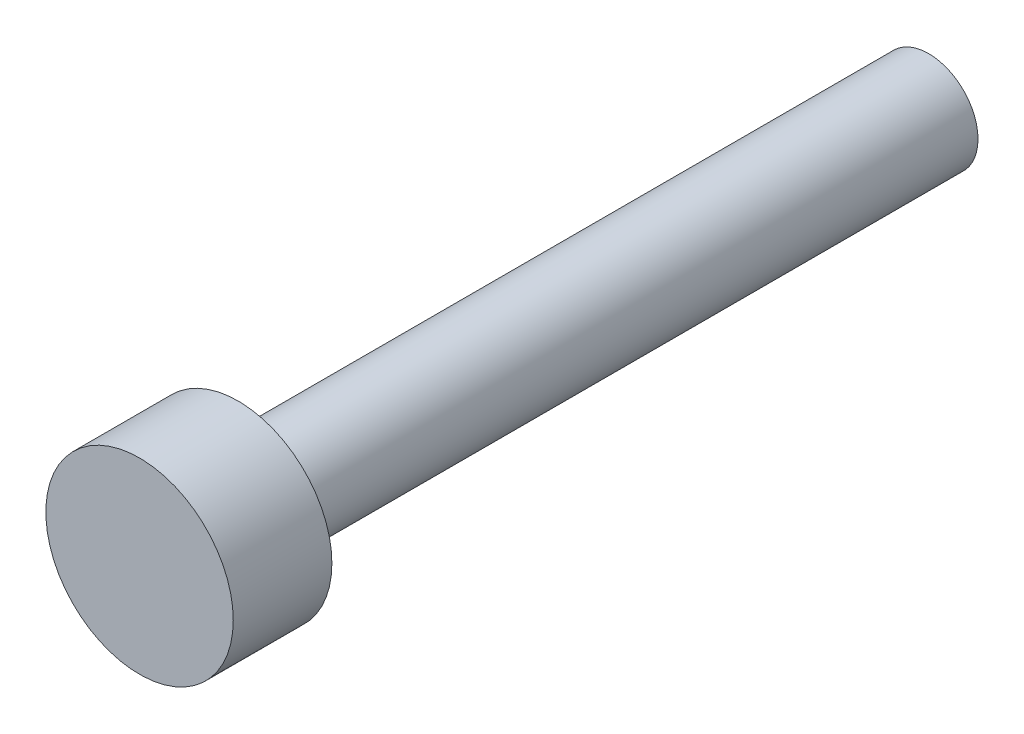
ISO-10303-21;
HEADER;
FILE_DESCRIPTION(('STEP AP214'),'2;1');
FILE_NAME('part.step','',(''),(''),'','','');
FILE_SCHEMA(('AUTOMOTIVE_DESIGN { 1 0 10303 214 1 1 1 1 }'));
ENDSEC;
DATA;
#1=APPLICATION_CONTEXT('core data for automotive mechanical design processes');
#2=APPLICATION_PROTOCOL_DEFINITION('international standard','automotive_design',2000,#1);
#3=PRODUCT_CONTEXT('',#1,'mechanical');
#4=PRODUCT('Part','Part','',(#3));
#5=PRODUCT_RELATED_PRODUCT_CATEGORY('part','',(#4));
#6=PRODUCT_DEFINITION_FORMATION('','',#4);
#7=PRODUCT_DEFINITION_CONTEXT('part definition',#1,'design');
#8=PRODUCT_DEFINITION('design','',#6,#7);
#9=PRODUCT_DEFINITION_SHAPE('','',#8);
#10=(LENGTH_UNIT() NAMED_UNIT(*) SI_UNIT(.MILLI.,.METRE.));
#11=(NAMED_UNIT(*) PLANE_ANGLE_UNIT() SI_UNIT($,.RADIAN.));
#12=(NAMED_UNIT(*) SI_UNIT($,.STERADIAN.) SOLID_ANGLE_UNIT());
#13=UNCERTAINTY_MEASURE_WITH_UNIT(LENGTH_MEASURE(1.E-05),#10,'distance_accuracy_value','');
#14=(GEOMETRIC_REPRESENTATION_CONTEXT(3) GLOBAL_UNCERTAINTY_ASSIGNED_CONTEXT((#13)) GLOBAL_UNIT_ASSIGNED_CONTEXT((#10,
#11,#12)) REPRESENTATION_CONTEXT('',''));
#15=CARTESIAN_POINT('',(0.,0.,0.));
#16=DIRECTION('',(0.,0.,1.));
#17=DIRECTION('',(1.,0.,0.));
#18=AXIS2_PLACEMENT_3D('',#15,#16,#17);
#19=CARTESIAN_POINT('',(0.,0.,0.));
#20=DIRECTION('',(0.,0.,-1.));
#21=DIRECTION('',(-1.,0.,0.));
#22=AXIS2_PLACEMENT_3D('',#19,#20,#21);
#23=CYLINDRICAL_SURFACE('',#22,1.);
#24=CARTESIAN_POINT('',(0.,0.,0.));
#25=DIRECTION('',(0.,0.,1.));
#26=DIRECTION('',(1.,0.,0.));
#27=AXIS2_PLACEMENT_3D('',#24,#25,#26);
#28=CIRCLE('',#27,1.);
#29=CARTESIAN_POINT('',(1.,0.,0.));
#30=VERTEX_POINT('',#29);
#31=EDGE_CURVE('E10',#30,#30,#28,.T.);
#32=ORIENTED_EDGE('',*,*,#31,.F.);
#33=EDGE_LOOP('',(#32));
#34=FACE_BOUND('',#33,.T.);
#35=CARTESIAN_POINT('',(0.,0.,-14.));
#36=DIRECTION('',(0.,0.,1.));
#37=DIRECTION('',(1.,0.,0.));
#38=AXIS2_PLACEMENT_3D('',#35,#36,#37);
#39=CIRCLE('',#38,1.);
#40=CARTESIAN_POINT('',(1.,0.,-14.));
#41=VERTEX_POINT('',#40);
#42=EDGE_CURVE('E37',#41,#41,#39,.T.);
#43=ORIENTED_EDGE('',*,*,#42,.T.);
#44=EDGE_LOOP('',(#43));
#45=FACE_BOUND('',#44,.T.);
#46=ADVANCED_FACE('F40',(#34,#45),#23,.T.);
#47=CARTESIAN_POINT('',(0.,0.,-14.));
#48=DIRECTION('',(0.,0.,1.));
#49=DIRECTION('',(1.,0.,0.));
#50=AXIS2_PLACEMENT_3D('',#47,#48,#49);
#51=PLANE('',#50);
#52=ORIENTED_EDGE('',*,*,#42,.F.);
#53=EDGE_LOOP('',(#52));
#54=FACE_BOUND('',#53,.T.);
#55=ADVANCED_FACE('F58',(#54),#51,.F.);
#56=CARTESIAN_POINT('',(0.,0.,2.));
#57=DIRECTION('',(0.,0.,-1.));
#58=DIRECTION('',(-1.,0.,0.));
#59=AXIS2_PLACEMENT_3D('',#56,#57,#58);
#60=CYLINDRICAL_SURFACE('',#59,1.9);
#61=CARTESIAN_POINT('',(0.,0.,2.));
#62=DIRECTION('',(0.,0.,1.));
#63=DIRECTION('',(1.,0.,0.));
#64=AXIS2_PLACEMENT_3D('',#61,#62,#63);
#65=CIRCLE('',#64,1.9);
#66=CARTESIAN_POINT('',(1.9,0.,2.));
#67=VERTEX_POINT('',#66);
#68=EDGE_CURVE('E50',#67,#67,#65,.T.);
#69=ORIENTED_EDGE('',*,*,#68,.F.);
#70=EDGE_LOOP('',(#69));
#71=FACE_BOUND('',#70,.T.);
#72=CARTESIAN_POINT('',(0.,0.,0.));
#73=DIRECTION('',(0.,0.,1.));
#74=DIRECTION('',(1.,0.,0.));
#75=AXIS2_PLACEMENT_3D('',#72,#73,#74);
#76=CIRCLE('',#75,1.9);
#77=CARTESIAN_POINT('',(1.9,0.,0.));
#78=VERTEX_POINT('',#77);
#79=EDGE_CURVE('E47',#78,#78,#76,.T.);
#80=ORIENTED_EDGE('',*,*,#79,.T.);
#81=EDGE_LOOP('',(#80));
#82=FACE_BOUND('',#81,.T.);
#83=ADVANCED_FACE('F60',(#71,#82),#60,.T.);
#84=CARTESIAN_POINT('',(0.,0.,2.));
#85=DIRECTION('',(0.,0.,1.));
#86=DIRECTION('',(1.,0.,0.));
#87=AXIS2_PLACEMENT_3D('',#84,#85,#86);
#88=PLANE('',#87);
#89=ORIENTED_EDGE('',*,*,#68,.T.);
#90=EDGE_LOOP('',(#89));
#91=FACE_BOUND('',#90,.T.);
#92=ADVANCED_FACE('F54',(#91),#88,.T.);
#93=CARTESIAN_POINT('',(0.,0.,0.));
#94=DIRECTION('',(0.,0.,1.));
#95=DIRECTION('',(1.,0.,0.));
#96=AXIS2_PLACEMENT_3D('',#93,#94,#95);
#97=PLANE('',#96);
#98=ORIENTED_EDGE('',*,*,#31,.T.);
#99=EDGE_LOOP('',(#98));
#100=FACE_BOUND('',#99,.T.);
#101=ORIENTED_EDGE('',*,*,#79,.F.);
#102=EDGE_LOOP('',(#101));
#103=FACE_BOUND('',#102,.T.);
#104=ADVANCED_FACE('F61',(#100,#103),#97,.F.);
#105=CLOSED_SHELL('',(#46,#55,#83,#92,#104));
#106=MANIFOLD_SOLID_BREP('B2',#105);
#107=ADVANCED_BREP_SHAPE_REPRESENTATION('',(#18,#106),#14);
#108=SHAPE_DEFINITION_REPRESENTATION(#9,#107);
ENDSEC;
END-ISO-10303-21;
